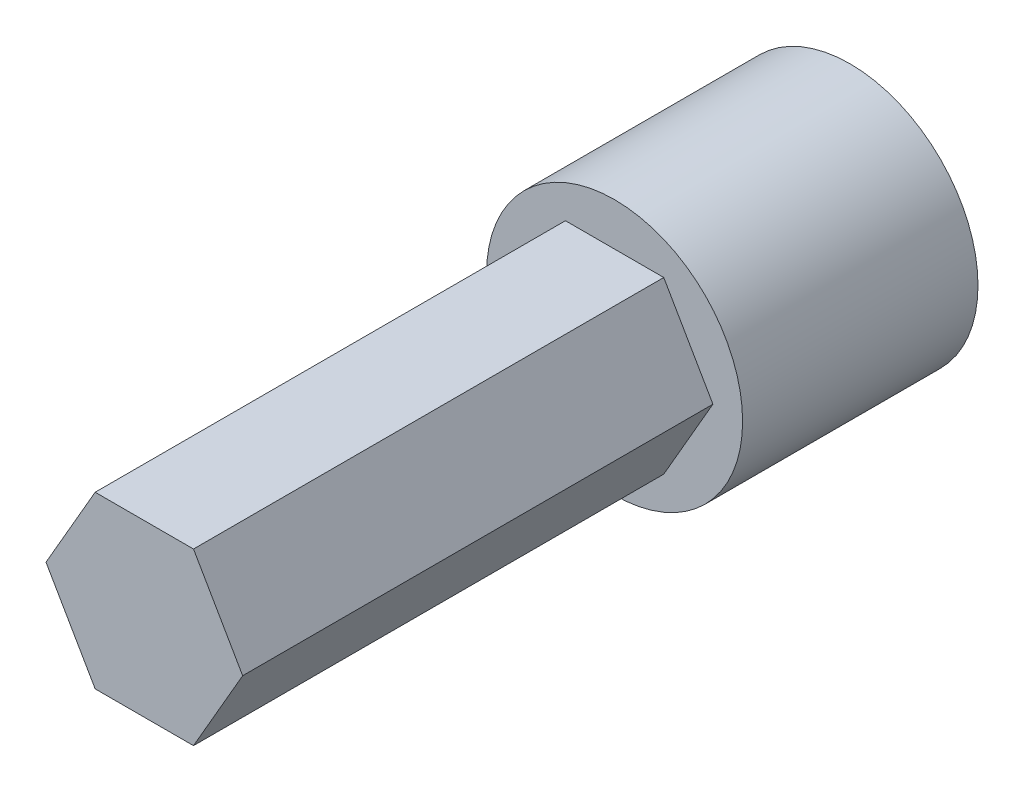
ISO-10303-21;
HEADER;
FILE_DESCRIPTION(('STEP AP214'),'2;1');
FILE_NAME('part.step','',(''),(''),'','','');
FILE_SCHEMA(('AUTOMOTIVE_DESIGN { 1 0 10303 214 1 1 1 1 }'));
ENDSEC;
DATA;
#1=APPLICATION_CONTEXT('core data for automotive mechanical design processes');
#2=APPLICATION_PROTOCOL_DEFINITION('international standard','automotive_design',2000,#1);
#3=PRODUCT_CONTEXT('',#1,'mechanical');
#4=PRODUCT('Part','Part','',(#3));
#5=PRODUCT_RELATED_PRODUCT_CATEGORY('part','',(#4));
#6=PRODUCT_DEFINITION_FORMATION('','',#4);
#7=PRODUCT_DEFINITION_CONTEXT('part definition',#1,'design');
#8=PRODUCT_DEFINITION('design','',#6,#7);
#9=PRODUCT_DEFINITION_SHAPE('','',#8);
#10=(LENGTH_UNIT() NAMED_UNIT(*) SI_UNIT(.MILLI.,.METRE.));
#11=(NAMED_UNIT(*) PLANE_ANGLE_UNIT() SI_UNIT($,.RADIAN.));
#12=(NAMED_UNIT(*) SI_UNIT($,.STERADIAN.) SOLID_ANGLE_UNIT());
#13=UNCERTAINTY_MEASURE_WITH_UNIT(LENGTH_MEASURE(1.E-05),#10,'distance_accuracy_value','');
#14=(GEOMETRIC_REPRESENTATION_CONTEXT(3) GLOBAL_UNCERTAINTY_ASSIGNED_CONTEXT((#13)) GLOBAL_UNIT_ASSIGNED_CONTEXT((#10,
#11,#12)) REPRESENTATION_CONTEXT('',''));
#15=CARTESIAN_POINT('',(0.,0.,0.));
#16=DIRECTION('',(0.,0.,1.));
#17=DIRECTION('',(1.,0.,0.));
#18=AXIS2_PLACEMENT_3D('',#15,#16,#17);
#19=CARTESIAN_POINT('',(4.60471480694878,0.,-22.0218));
#20=DIRECTION('',(0.866025403784439,0.5,0.));
#21=DIRECTION('',(-0.5,0.866025403784439,0.));
#22=AXIS2_PLACEMENT_3D('',#19,#20,#21);
#23=PLANE('',#22);
#24=DIRECTION('',(-0.5,0.866025403784438,0.));
#25=VECTOR('',#24,1.);
#26=CARTESIAN_POINT('',(4.60471480694878,0.,0.));
#27=LINE('',#26,#25);
#28=CARTESIAN_POINT('',(4.60471480694878,0.,0.));
#29=VERTEX_POINT('',#28);
#30=CARTESIAN_POINT('',(2.30235740347439,3.9878,0.));
#31=VERTEX_POINT('',#30);
#32=EDGE_CURVE('E146',#29,#31,#27,.T.);
#33=ORIENTED_EDGE('',*,*,#32,.F.);
#34=DIRECTION('',(0.,0.,1.));
#35=VECTOR('',#34,1.);
#36=CARTESIAN_POINT('',(4.60471480694878,0.,-22.0218));
#37=LINE('',#36,#35);
#38=CARTESIAN_POINT('',(4.60471480694878,0.,-22.0218));
#39=VERTEX_POINT('',#38);
#40=EDGE_CURVE('E11',#39,#29,#37,.T.);
#41=ORIENTED_EDGE('',*,*,#40,.F.);
#42=DIRECTION('',(-0.5,0.866025403784438,0.));
#43=VECTOR('',#42,1.);
#44=CARTESIAN_POINT('',(4.60471480694878,0.,-22.0218));
#45=LINE('',#44,#43);
#46=CARTESIAN_POINT('',(2.30235740347439,3.9878,-22.0218));
#47=VERTEX_POINT('',#46);
#48=EDGE_CURVE('E117',#39,#47,#45,.T.);
#49=ORIENTED_EDGE('',*,*,#48,.T.);
#50=DIRECTION('',(0.,0.,1.));
#51=VECTOR('',#50,1.);
#52=CARTESIAN_POINT('',(2.30235740347439,3.9878,-22.0218));
#53=LINE('',#52,#51);
#54=EDGE_CURVE('E132',#47,#31,#53,.T.);
#55=ORIENTED_EDGE('',*,*,#54,.T.);
#56=EDGE_LOOP('',(#33,#41,#49,#55));
#57=FACE_BOUND('',#56,.T.);
#58=ADVANCED_FACE('F43',(#57),#23,.T.);
#59=CARTESIAN_POINT('',(2.30235740347439,-3.9878,-22.0218));
#60=DIRECTION('',(0.866025403784438,-0.5,0.));
#61=DIRECTION('',(0.5,0.866025403784439,0.));
#62=AXIS2_PLACEMENT_3D('',#59,#60,#61);
#63=PLANE('',#62);
#64=DIRECTION('',(0.5,0.866025403784439,0.));
#65=VECTOR('',#64,1.);
#66=CARTESIAN_POINT('',(2.30235740347439,-3.9878,0.));
#67=LINE('',#66,#65);
#68=CARTESIAN_POINT('',(2.30235740347439,-3.9878,0.));
#69=VERTEX_POINT('',#68);
#70=EDGE_CURVE('E107',#69,#29,#67,.T.);
#71=ORIENTED_EDGE('',*,*,#70,.F.);
#72=DIRECTION('',(0.,0.,1.));
#73=VECTOR('',#72,1.);
#74=CARTESIAN_POINT('',(2.30235740347439,-3.9878,-22.0218));
#75=LINE('',#74,#73);
#76=CARTESIAN_POINT('',(2.30235740347439,-3.9878,-22.0218));
#77=VERTEX_POINT('',#76);
#78=EDGE_CURVE('E58',#77,#69,#75,.T.);
#79=ORIENTED_EDGE('',*,*,#78,.F.);
#80=DIRECTION('',(0.5,0.866025403784439,0.));
#81=VECTOR('',#80,1.);
#82=CARTESIAN_POINT('',(2.30235740347439,-3.9878,-22.0218));
#83=LINE('',#82,#81);
#84=EDGE_CURVE('E134',#77,#39,#83,.T.);
#85=ORIENTED_EDGE('',*,*,#84,.T.);
#86=ORIENTED_EDGE('',*,*,#40,.T.);
#87=EDGE_LOOP('',(#71,#79,#85,#86));
#88=FACE_BOUND('',#87,.T.);
#89=ADVANCED_FACE('F113',(#88),#63,.T.);
#90=CARTESIAN_POINT('',(-2.30235740347439,-3.9878,-22.0218));
#91=DIRECTION('',(0.,-1.,0.));
#92=DIRECTION('',(0.,0.,-1.));
#93=AXIS2_PLACEMENT_3D('',#90,#91,#92);
#94=PLANE('',#93);
#95=DIRECTION('',(1.,0.,0.));
#96=VECTOR('',#95,1.);
#97=CARTESIAN_POINT('',(-2.30235740347439,-3.9878,0.));
#98=LINE('',#97,#96);
#99=CARTESIAN_POINT('',(-2.30235740347439,-3.9878,0.));
#100=VERTEX_POINT('',#99);
#101=EDGE_CURVE('E92',#100,#69,#98,.T.);
#102=ORIENTED_EDGE('',*,*,#101,.F.);
#103=DIRECTION('',(0.,0.,1.));
#104=VECTOR('',#103,1.);
#105=CARTESIAN_POINT('',(-2.30235740347439,-3.9878,-22.0218));
#106=LINE('',#105,#104);
#107=CARTESIAN_POINT('',(-2.30235740347439,-3.9878,-22.0218));
#108=VERTEX_POINT('',#107);
#109=EDGE_CURVE('E101',#108,#100,#106,.T.);
#110=ORIENTED_EDGE('',*,*,#109,.F.);
#111=DIRECTION('',(1.,0.,0.));
#112=VECTOR('',#111,1.);
#113=CARTESIAN_POINT('',(-2.30235740347439,-3.9878,-22.0218));
#114=LINE('',#113,#112);
#115=EDGE_CURVE('E96',#108,#77,#114,.T.);
#116=ORIENTED_EDGE('',*,*,#115,.T.);
#117=ORIENTED_EDGE('',*,*,#78,.T.);
#118=EDGE_LOOP('',(#102,#110,#116,#117));
#119=FACE_BOUND('',#118,.T.);
#120=ADVANCED_FACE('F90',(#119),#94,.T.);
#121=CARTESIAN_POINT('',(-4.60471480694878,0.,-22.0218));
#122=DIRECTION('',(-0.866025403784439,-0.5,0.));
#123=DIRECTION('',(0.5,-0.866025403784439,0.));
#124=AXIS2_PLACEMENT_3D('',#121,#122,#123);
#125=PLANE('',#124);
#126=DIRECTION('',(0.5,-0.866025403784438,0.));
#127=VECTOR('',#126,1.);
#128=CARTESIAN_POINT('',(-4.60471480694878,0.,0.));
#129=LINE('',#128,#127);
#130=CARTESIAN_POINT('',(-4.60471480694878,0.,0.));
#131=VERTEX_POINT('',#130);
#132=EDGE_CURVE('E110',#131,#100,#129,.T.);
#133=ORIENTED_EDGE('',*,*,#132,.F.);
#134=DIRECTION('',(0.,0.,1.));
#135=VECTOR('',#134,1.);
#136=CARTESIAN_POINT('',(-4.60471480694878,0.,-22.0218));
#137=LINE('',#136,#135);
#138=CARTESIAN_POINT('',(-4.60471480694878,0.,-22.0218));
#139=VERTEX_POINT('',#138);
#140=EDGE_CURVE('E127',#139,#131,#137,.T.);
#141=ORIENTED_EDGE('',*,*,#140,.F.);
#142=DIRECTION('',(0.5,-0.866025403784438,0.));
#143=VECTOR('',#142,1.);
#144=CARTESIAN_POINT('',(-4.60471480694878,0.,-22.0218));
#145=LINE('',#144,#143);
#146=EDGE_CURVE('E142',#139,#108,#145,.T.);
#147=ORIENTED_EDGE('',*,*,#146,.T.);
#148=ORIENTED_EDGE('',*,*,#109,.T.);
#149=EDGE_LOOP('',(#133,#141,#147,#148));
#150=FACE_BOUND('',#149,.T.);
#151=ADVANCED_FACE('F224',(#150),#125,.T.);
#152=CARTESIAN_POINT('',(-2.30235740347439,3.9878,-22.0218));
#153=DIRECTION('',(-0.866025403784439,0.5,0.));
#154=DIRECTION('',(-0.5,-0.866025403784439,0.));
#155=AXIS2_PLACEMENT_3D('',#152,#153,#154);
#156=PLANE('',#155);
#157=DIRECTION('',(-0.5,-0.866025403784439,0.));
#158=VECTOR('',#157,1.);
#159=CARTESIAN_POINT('',(-2.30235740347439,3.9878,0.));
#160=LINE('',#159,#158);
#161=CARTESIAN_POINT('',(-2.30235740347439,3.9878,0.));
#162=VERTEX_POINT('',#161);
#163=EDGE_CURVE('E154',#162,#131,#160,.T.);
#164=ORIENTED_EDGE('',*,*,#163,.F.);
#165=DIRECTION('',(0.,0.,1.));
#166=VECTOR('',#165,1.);
#167=CARTESIAN_POINT('',(-2.30235740347439,3.9878,-22.0218));
#168=LINE('',#167,#166);
#169=CARTESIAN_POINT('',(-2.30235740347439,3.9878,-22.0218));
#170=VERTEX_POINT('',#169);
#171=EDGE_CURVE('E130',#170,#162,#168,.T.);
#172=ORIENTED_EDGE('',*,*,#171,.F.);
#173=DIRECTION('',(-0.5,-0.866025403784439,0.));
#174=VECTOR('',#173,1.);
#175=CARTESIAN_POINT('',(-2.30235740347439,3.9878,-22.0218));
#176=LINE('',#175,#174);
#177=EDGE_CURVE('E66',#170,#139,#176,.T.);
#178=ORIENTED_EDGE('',*,*,#177,.T.);
#179=ORIENTED_EDGE('',*,*,#140,.T.);
#180=EDGE_LOOP('',(#164,#172,#178,#179));
#181=FACE_BOUND('',#180,.T.);
#182=ADVANCED_FACE('F219',(#181),#156,.T.);
#183=CARTESIAN_POINT('',(2.30235740347439,3.9878,-22.0218));
#184=DIRECTION('',(0.,1.,0.));
#185=DIRECTION('',(0.,0.,1.));
#186=AXIS2_PLACEMENT_3D('',#183,#184,#185);
#187=PLANE('',#186);
#188=DIRECTION('',(-1.,0.,0.));
#189=VECTOR('',#188,1.);
#190=CARTESIAN_POINT('',(2.30235740347439,3.9878,0.));
#191=LINE('',#190,#189);
#192=EDGE_CURVE('E149',#31,#162,#191,.T.);
#193=ORIENTED_EDGE('',*,*,#192,.F.);
#194=ORIENTED_EDGE('',*,*,#54,.F.);
#195=DIRECTION('',(-1.,0.,0.));
#196=VECTOR('',#195,1.);
#197=CARTESIAN_POINT('',(2.30235740347439,3.9878,-22.0218));
#198=LINE('',#197,#196);
#199=EDGE_CURVE('E121',#47,#170,#198,.T.);
#200=ORIENTED_EDGE('',*,*,#199,.T.);
#201=ORIENTED_EDGE('',*,*,#171,.T.);
#202=EDGE_LOOP('',(#193,#194,#200,#201));
#203=FACE_BOUND('',#202,.T.);
#204=ADVANCED_FACE('F215',(#203),#187,.T.);
#205=CARTESIAN_POINT('',(0.,0.,0.));
#206=DIRECTION('',(0.,0.,1.));
#207=DIRECTION('',(1.,0.,0.));
#208=AXIS2_PLACEMENT_3D('',#205,#206,#207);
#209=PLANE('',#208);
#210=ORIENTED_EDGE('',*,*,#32,.T.);
#211=ORIENTED_EDGE('',*,*,#192,.T.);
#212=ORIENTED_EDGE('',*,*,#163,.T.);
#213=ORIENTED_EDGE('',*,*,#132,.T.);
#214=ORIENTED_EDGE('',*,*,#101,.T.);
#215=ORIENTED_EDGE('',*,*,#70,.T.);
#216=EDGE_LOOP('',(#210,#211,#212,#213,#214,#215));
#217=FACE_BOUND('',#216,.T.);
#218=ADVANCED_FACE('F106',(#217),#209,.T.);
#219=CARTESIAN_POINT('',(0.,0.,-33.0454));
#220=DIRECTION('',(0.,0.,1.));
#221=DIRECTION('',(1.,0.,0.));
#222=AXIS2_PLACEMENT_3D('',#219,#220,#221);
#223=CYLINDRICAL_SURFACE('',#222,5.9944);
#224=CARTESIAN_POINT('',(-4.43845528412342,-4.02901303681644,-29.2354));
#225=CARTESIAN_POINT('',(-4.43845776241539,-4.02901158603755,-29.3058721122266));
#226=CARTESIAN_POINT('',(-4.44251134922713,-4.02455862027529,-29.3763747486204));
#227=CARTESIAN_POINT('',(-4.45850855616532,-4.00682793970532,-29.5153790087802));
#228=CARTESIAN_POINT('',(-4.47045810912053,-3.99354358917329,-29.5838790874297));
#229=CARTESIAN_POINT('',(-4.50158186470221,-3.95842623952485,-29.7168472743186));
#230=CARTESIAN_POINT('',(-4.52074841941931,-3.93660228892899,-29.7813195668025));
#231=CARTESIAN_POINT('',(-4.56532840051582,-3.88481276611611,-29.9045706468878));
#232=CARTESIAN_POINT('',(-4.59074161600226,-3.8548474687548,-29.9633496266072));
#233=CARTESIAN_POINT('',(-4.64701513164665,-3.78682616667383,-30.0744792522474));
#234=CARTESIAN_POINT('',(-4.67794781986696,-3.74866106517343,-30.1267264828467));
#235=CARTESIAN_POINT('',(-4.74361676899912,-3.66520743507961,-30.2224048709838));
#236=CARTESIAN_POINT('',(-4.77835331408443,-3.61991837416852,-30.2658353691604));
#237=CARTESIAN_POINT('',(-4.85052258904617,-3.52263540719384,-30.3430536247508));
#238=CARTESIAN_POINT('',(-4.88797847292026,-3.47057994835762,-30.3767423605947));
#239=CARTESIAN_POINT('',(-4.96376101863079,-3.36129786327118,-30.4328807850948));
#240=CARTESIAN_POINT('',(-5.00208758843806,-3.30407178165576,-30.4553316558385));
#241=CARTESIAN_POINT('',(-5.07760223704151,-3.18678175155763,-30.4880330389489));
#242=CARTESIAN_POINT('',(-5.11479877001745,-3.12677203807768,-30.4984584339973));
#243=CARTESIAN_POINT('',(-5.18738668026429,-3.00481017115259,-30.5073592763601));
#244=CARTESIAN_POINT('',(-5.22277825138895,-2.94285822746279,-30.5058360096984));
#245=CARTESIAN_POINT('',(-5.29019624436891,-2.81984026026947,-30.4910139185905));
#246=CARTESIAN_POINT('',(-5.3222673831065,-2.75877588975423,-30.4779035475392));
#247=CARTESIAN_POINT('',(-5.3829761365,-2.63836100185378,-30.4405791845301));
#248=CARTESIAN_POINT('',(-5.4116136023003,-2.57901055885489,-30.4163647114098));
#249=CARTESIAN_POINT('',(-5.46520527360223,-2.46342306328636,-30.3573498561157));
#250=CARTESIAN_POINT('',(-5.49013252477241,-2.40721048893399,-30.322477140781));
#251=CARTESIAN_POINT('',(-5.53586767276154,-2.30008651533994,-30.2431894868939));
#252=CARTESIAN_POINT('',(-5.55667504029393,-2.24917579763211,-30.1987733238094));
#253=CARTESIAN_POINT('',(-5.59451778670298,-2.15334906342629,-30.1006306076833));
#254=CARTESIAN_POINT('',(-5.61147153105505,-2.10856959622029,-30.0467391123945));
#255=CARTESIAN_POINT('',(-5.64117647357777,-2.02776190966453,-29.9317169832824));
#256=CARTESIAN_POINT('',(-5.65392757158822,-1.99173389889056,-29.8705861769744));
#257=CARTESIAN_POINT('',(-5.67540475256023,-1.92968861910304,-29.7425743765213));
#258=CARTESIAN_POINT('',(-5.68412013163629,-1.9036980020684,-29.675678642559));
#259=CARTESIAN_POINT('',(-5.69761591761673,-1.86291983847047,-29.5381796912991));
#260=CARTESIAN_POINT('',(-5.70239690634732,-1.84813063544346,-29.4675770238344));
#261=CARTESIAN_POINT('',(-5.70806253108008,-1.83055674773179,-29.3261174414924));
#262=CARTESIAN_POINT('',(-5.70902005458161,-1.82754752107186,-29.2552913074714));
#263=CARTESIAN_POINT('',(-5.70725844034468,-1.83304133646233,-29.1141367029739));
#264=CARTESIAN_POINT('',(-5.70453953842717,-1.84154364011618,-29.0438082008684));
#265=CARTESIAN_POINT('',(-5.69542367977153,-1.86954301658048,-28.9064386909404));
#266=CARTESIAN_POINT('',(-5.68906741925722,-1.88891839147313,-28.8393700730105));
#267=CARTESIAN_POINT('',(-5.67259989192555,-1.9378088467073,-28.7095286304978));
#268=CARTESIAN_POINT('',(-5.66248828418409,-1.9673248476336,-28.6467561965512));
#269=CARTESIAN_POINT('',(-5.63819636939435,-2.03590533964759,-28.5262855696315));
#270=CARTESIAN_POINT('',(-5.62395914428911,-2.07510218834596,-28.4686742385116));
#271=CARTESIAN_POINT('',(-5.5913446788828,-2.16143951385938,-28.3610756355755));
#272=CARTESIAN_POINT('',(-5.57296695766876,-2.20858091326271,-28.3110892505184));
#273=CARTESIAN_POINT('',(-5.53165299351339,-2.31012928649021,-28.219271056945));
#274=CARTESIAN_POINT('',(-5.50864303022974,-2.36464836012424,-28.1775961863675));
#275=CARTESIAN_POINT('',(-5.45836241478591,-2.47850319757864,-28.1047028555241));
#276=CARTESIAN_POINT('',(-5.43109195473128,-2.5378387441666,-28.073483924));
#277=CARTESIAN_POINT('',(-5.37278996410345,-2.65903157838443,-28.0226110764688));
#278=CARTESIAN_POINT('',(-5.34178282161566,-2.72087093353603,-28.0028865996924));
#279=CARTESIAN_POINT('',(-5.27647388841536,-2.84545189949601,-27.9753409232297));
#280=CARTESIAN_POINT('',(-5.24217254623361,-2.9081933864858,-27.9675181054765));
#281=CARTESIAN_POINT('',(-5.17186623739874,-3.03142979494974,-27.9640667818623));
#282=CARTESIAN_POINT('',(-5.13590756060616,-3.09194466527735,-27.9682033595352));
#283=CARTESIAN_POINT('',(-5.06277923249063,-3.21028614107004,-27.9880304921672));
#284=CARTESIAN_POINT('',(-5.02560960038431,-3.2681127891592,-28.0037208638645));
#285=CARTESIAN_POINT('',(-4.95143945274324,-3.37942943664585,-28.0461006112399));
#286=CARTESIAN_POINT('',(-4.91443875691107,-3.43293130455754,-28.0727585710765));
#287=CARTESIAN_POINT('',(-4.84185778783637,-3.53456488655606,-28.1362853784201));
#288=CARTESIAN_POINT('',(-4.80627764344167,-3.58269611421879,-28.1731551497695));
#289=CARTESIAN_POINT('',(-4.73731413927005,-3.6734173429378,-28.2568349483848));
#290=CARTESIAN_POINT('',(-4.70398157469183,-3.71589258252887,-28.3038112728619));
#291=CARTESIAN_POINT('',(-4.64165468929655,-3.7934621343707,-28.4060328507187));
#292=CARTESIAN_POINT('',(-4.6126614082823,-3.82855467835427,-28.4612800796939));
#293=CARTESIAN_POINT('',(-4.56003563927137,-3.89109263777133,-28.5792965699655));
#294=CARTESIAN_POINT('',(-4.5364739099659,-3.91843807555586,-28.6421504343783));
#295=CARTESIAN_POINT('',(-4.49640247787302,-3.96435772443731,-28.7730531185369));
#296=CARTESIAN_POINT('',(-4.47988664475047,-3.98293956186222,-28.8410973613328));
#297=CARTESIAN_POINT('',(-4.45781547833449,-4.00760671933172,-28.9636032968355));
#298=CARTESIAN_POINT('',(-4.45057803047669,-4.01562431880517,-29.0173870094483));
#299=CARTESIAN_POINT('',(-4.44089707357674,-4.0263279266125,-29.1259076996371));
#300=CARTESIAN_POINT('',(-4.43845335854217,-4.02901416404144,-29.1806446361499));
#301=CARTESIAN_POINT('',(-4.43845528412342,-4.02901303681644,-29.2354));
#302=B_SPLINE_CURVE_WITH_KNOTS('',3,(#224,#225,#226,#227,#228,#229,#230,#231,#232,#233,#234,
#235,#236,#237,#238,#239,#240,#241,#242,#243,#244,#245,#246,#247,#248,#249,#250,#251,#252,#253,
#254,#255,#256,#257,#258,#259,#260,#261,#262,#263,#264,#265,#266,#267,#268,#269,#270,#271,#272,
#273,#274,#275,#276,#277,#278,#279,#280,#281,#282,#283,#284,#285,#286,#287,#288,#289,#290,#291,
#292,#293,#294,#295,#296,#297,#298,#299,#300,#301),.UNSPECIFIED.,.T.,.F.,(4,2,2,2,2,2,2,2,2,2,2,
2,2,2,2,2,2,2,2,2,2,2,2,2,2,2,2,2,2,2,2,2,2,2,2,2,2,2,4),(0.,0.211215735439656,0.42259035376515,
0.633741604396407,0.844885727347391,1.05903541647215,1.27320111493335,1.48947281277973,
1.70572175667848,1.91878455464646,2.1318244211696,2.34146187451594,2.55110841272222,
2.76221057713853,2.97333984453977,3.18859390424809,3.40385309366087,3.61967998744662,
3.83547495854306,4.04713596581846,4.258783396936,4.46810787978994,4.67745137053093,
4.88983299699031,5.10223930401376,5.31833964366341,5.53443024217216,5.74917996294176,
5.96390048522001,6.17443211497925,6.38496040543909,6.59488980600305,6.80483820467023,
7.01854906577204,7.23231105572558,7.44871760573919,7.66493548368951,7.8290527647232,
7.99316299328696),.UNSPECIFIED.);
#303=CARTESIAN_POINT('',(-4.43845528412342,-4.02901303681644,-29.2354));
#304=VERTEX_POINT('',#303);
#305=EDGE_CURVE('E172',#304,#304,#302,.T.);
#306=ORIENTED_EDGE('',*,*,#305,.T.);
#307=EDGE_LOOP('',(#306));
#308=FACE_BOUND('',#307,.T.);
#309=CARTESIAN_POINT('',(0.,0.,-33.0454));
#310=DIRECTION('',(0.,0.,-1.));
#311=DIRECTION('',(-1.,0.,0.));
#312=AXIS2_PLACEMENT_3D('',#309,#310,#311);
#313=CIRCLE('',#312,5.9944);
#314=CARTESIAN_POINT('',(-5.9944,0.,-33.0454));
#315=VERTEX_POINT('',#314);
#316=EDGE_CURVE('E150',#315,#315,#313,.T.);
#317=ORIENTED_EDGE('',*,*,#316,.F.);
#318=EDGE_LOOP('',(#317));
#319=FACE_BOUND('',#318,.T.);
#320=CARTESIAN_POINT('',(0.,0.,-22.0218));
#321=DIRECTION('',(0.,0.,-1.));
#322=DIRECTION('',(-1.,0.,0.));
#323=AXIS2_PLACEMENT_3D('',#320,#321,#322);
#324=CIRCLE('',#323,5.9944);
#325=CARTESIAN_POINT('',(-5.9944,0.,-22.0218));
#326=VERTEX_POINT('',#325);
#327=EDGE_CURVE('E160',#326,#326,#324,.T.);
#328=ORIENTED_EDGE('',*,*,#327,.T.);
#329=EDGE_LOOP('',(#328));
#330=FACE_BOUND('',#329,.T.);
#331=ADVANCED_FACE('F189',(#308,#319,#330),#223,.T.);
#332=CARTESIAN_POINT('',(0.,0.,-33.0454));
#333=DIRECTION('',(0.,0.,-1.));
#334=DIRECTION('',(-1.,0.,0.));
#335=AXIS2_PLACEMENT_3D('',#332,#333,#334);
#336=PLANE('',#335);
#337=CARTESIAN_POINT('',(0.,0.,-33.0454));
#338=DIRECTION('',(0.,0.,-1.));
#339=DIRECTION('',(-1.,0.,0.));
#340=AXIS2_PLACEMENT_3D('',#337,#338,#339);
#341=CIRCLE('',#340,3.0226);
#342=CARTESIAN_POINT('',(-3.0226,0.,-33.0454));
#343=VERTEX_POINT('',#342);
#344=EDGE_CURVE('E168',#343,#343,#341,.T.);
#345=ORIENTED_EDGE('',*,*,#344,.F.);
#346=EDGE_LOOP('',(#345));
#347=FACE_BOUND('',#346,.T.);
#348=ORIENTED_EDGE('',*,*,#316,.T.);
#349=EDGE_LOOP('',(#348));
#350=FACE_BOUND('',#349,.T.);
#351=ADVANCED_FACE('F192',(#347,#350),#336,.T.);
#352=CARTESIAN_POINT('',(0.,0.,-22.0218));
#353=DIRECTION('',(0.,0.,-1.));
#354=DIRECTION('',(-1.,0.,0.));
#355=AXIS2_PLACEMENT_3D('',#352,#353,#354);
#356=PLANE('',#355);
#357=ORIENTED_EDGE('',*,*,#48,.F.);
#358=ORIENTED_EDGE('',*,*,#84,.F.);
#359=ORIENTED_EDGE('',*,*,#115,.F.);
#360=ORIENTED_EDGE('',*,*,#146,.F.);
#361=ORIENTED_EDGE('',*,*,#177,.F.);
#362=ORIENTED_EDGE('',*,*,#199,.F.);
#363=EDGE_LOOP('',(#357,#358,#359,#360,#361,#362));
#364=FACE_BOUND('',#363,.T.);
#365=ORIENTED_EDGE('',*,*,#327,.F.);
#366=EDGE_LOOP('',(#365));
#367=FACE_BOUND('',#366,.T.);
#368=ADVANCED_FACE('F198',(#364,#367),#356,.F.);
#369=CARTESIAN_POINT('',(0.,0.,-20.4978));
#370=DIRECTION('',(0.,0.,-1.));
#371=DIRECTION('',(-1.,0.,0.));
#372=AXIS2_PLACEMENT_3D('',#369,#370,#371);
#373=CYLINDRICAL_SURFACE('',#372,3.0226);
#374=CARTESIAN_POINT('',(-1.74037535349678,-2.47127586257402,-29.2354));
#375=CARTESIAN_POINT('',(-1.74038574040388,-2.47127293099558,-29.1677198535723));
#376=CARTESIAN_POINT('',(-1.745298684187,-2.46783164541109,-29.0999315930915));
#377=CARTESIAN_POINT('',(-1.76456533567846,-2.45408846247741,-28.9663149199554));
#378=CARTESIAN_POINT('',(-1.77894447971183,-2.44376807958884,-28.9004922886379));
#379=CARTESIAN_POINT('',(-1.8159189809182,-2.41641707968234,-28.7729826565052));
#380=CARTESIAN_POINT('',(-1.83848044393106,-2.39941412036739,-28.7112798207661));
#381=CARTESIAN_POINT('',(-1.89029426785057,-2.35880846760659,-28.5931302994877));
#382=CARTESIAN_POINT('',(-1.91954512446635,-2.33520725769055,-28.5366824362354));
#383=CARTESIAN_POINT('',(-1.98493542913538,-2.27992870339442,-28.4270383756119));
#384=CARTESIAN_POINT('',(-2.0213739405885,-2.24786549935304,-28.3742148964577));
#385=CARTESIAN_POINT('',(-2.09799438975993,-2.17652684283326,-28.2767537616026));
#386=CARTESIAN_POINT('',(-2.1381777759255,-2.13724859395943,-28.2321192932385));
#387=CARTESIAN_POINT('',(-2.22220738778757,-2.04981369671624,-28.1503908872774));
#388=CARTESIAN_POINT('',(-2.26613701117562,-2.00134115783873,-28.1137178676451));
#389=CARTESIAN_POINT('',(-2.35382316007563,-1.89742929784626,-28.0518108893635));
#390=CARTESIAN_POINT('',(-2.39757975480868,-1.84199313329928,-28.0265717715268));
#391=CARTESIAN_POINT('',(-2.48057157259551,-1.72845462962706,-27.9896047103132));
#392=CARTESIAN_POINT('',(-2.51992353658396,-1.67064770600666,-27.9772336194802));
#393=CARTESIAN_POINT('',(-2.59499297636038,-1.55147459333462,-27.9642740643643));
#394=CARTESIAN_POINT('',(-2.6307119466395,-1.49010988427964,-27.9636807354447));
#395=CARTESIAN_POINT('',(-2.695267896216,-1.36968027239344,-27.9739599081308));
#396=CARTESIAN_POINT('',(-2.72439392801596,-1.31070796168314,-27.9841253258336));
#397=CARTESIAN_POINT('',(-2.77788019935574,-1.19317351872432,-28.0144193038228));
#398=CARTESIAN_POINT('',(-2.80224008708994,-1.13461141706214,-28.0345485991907));
#399=CARTESIAN_POINT('',(-2.84642741531149,-1.01875791634732,-28.0844360885251));
#400=CARTESIAN_POINT('',(-2.866179922758,-0.961499600665749,-28.1143366947793));
#401=CARTESIAN_POINT('',(-2.90095660182288,-0.850841247691567,-28.1827770589749));
#402=CARTESIAN_POINT('',(-2.91597908892952,-0.797442590151058,-28.2213198863404));
#403=CARTESIAN_POINT('',(-2.94276158166415,-0.69239461923849,-28.3091544755221));
#404=CARTESIAN_POINT('',(-2.95421147571532,-0.641143450085701,-28.3590177895639));
#405=CARTESIAN_POINT('',(-2.97316091687768,-0.546585292309441,-28.4664694602733));
#406=CARTESIAN_POINT('',(-2.9806588895038,-0.503281474462009,-28.5240608844503));
#407=CARTESIAN_POINT('',(-2.9928283393131,-0.425101746559035,-28.6477968786474));
#408=CARTESIAN_POINT('',(-2.9973953872699,-0.390561288286234,-28.7141652077058));
#409=CARTESIAN_POINT('',(-3.00424589123179,-0.333831565157288,-28.8520895618436));
#410=CARTESIAN_POINT('',(-3.0065310130255,-0.311633295852227,-28.9236417617514));
#411=CARTESIAN_POINT('',(-3.00944171761176,-0.282097180848341,-29.0648907696331));
#412=CARTESIAN_POINT('',(-3.01016640514934,-0.273879379796487,-29.134400973544));
#413=CARTESIAN_POINT('',(-3.01050774868045,-0.27011121895331,-29.2737554376828));
#414=CARTESIAN_POINT('',(-3.01012479890887,-0.27455635210916,-29.3435995702231));
#415=CARTESIAN_POINT('',(-3.00817689622318,-0.295083270870349,-29.4768104361763));
#416=CARTESIAN_POINT('',(-3.00669111418424,-0.31038272670967,-29.540301558485));
#417=CARTESIAN_POINT('',(-3.00223327633599,-0.350881753063433,-29.6639803158033));
#418=CARTESIAN_POINT('',(-2.99926086916554,-0.376083663702993,-29.7241671661203));
#419=CARTESIAN_POINT('',(-2.99108209202925,-0.436465114997177,-29.8424022202715));
#420=CARTESIAN_POINT('',(-2.98578575892884,-0.472024720356395,-29.900249393447));
#421=CARTESIAN_POINT('',(-2.97219559729114,-0.551157178102823,-30.0097917126596));
#422=CARTESIAN_POINT('',(-2.96390045472655,-0.594733539178794,-30.0614841485751));
#423=CARTESIAN_POINT('',(-2.94270002362393,-0.692328598908397,-30.1617188539098));
#424=CARTESIAN_POINT('',(-2.92946907330039,-0.746913977595261,-30.2096429517609));
#425=CARTESIAN_POINT('',(-2.89773269217689,-0.861862770101649,-30.2958824464475));
#426=CARTESIAN_POINT('',(-2.8792268352237,-0.922226650497455,-30.3341970664748));
#427=CARTESIAN_POINT('',(-2.83627889135153,-1.04689430503433,-30.4001118568467));
#428=CARTESIAN_POINT('',(-2.81181788028674,-1.11121014058753,-30.4276771268366));
#429=CARTESIAN_POINT('',(-2.75686821798978,-1.24127326962292,-30.4707847572291));
#430=CARTESIAN_POINT('',(-2.72638323553752,-1.3070196702664,-30.4863344073403));
#431=CARTESIAN_POINT('',(-2.66226261722544,-1.43286447358454,-30.5040401304298));
#432=CARTESIAN_POINT('',(-2.62900340869437,-1.49303292109783,-30.5070673490937));
#433=CARTESIAN_POINT('',(-2.55866781179238,-1.61059565675477,-30.5019932189274));
#434=CARTESIAN_POINT('',(-2.52159211385119,-1.667990443922,-30.4938938797082));
#435=CARTESIAN_POINT('',(-2.4463758262619,-1.7763880323212,-30.4674220336295));
#436=CARTESIAN_POINT('',(-2.40832360165081,-1.82754773656352,-30.4494355826215));
#437=CARTESIAN_POINT('',(-2.33133065704373,-1.92480093455984,-30.404125040872));
#438=CARTESIAN_POINT('',(-2.29238977104755,-1.97089347226643,-30.3767991920025));
#439=CARTESIAN_POINT('',(-2.2133497627341,-2.05933746286991,-30.3122025137719));
#440=CARTESIAN_POINT('',(-2.17327818661226,-2.10142451097968,-30.2745369240842));
#441=CARTESIAN_POINT('',(-2.09548316898046,-2.17900999187792,-30.1909005099903));
#442=CARTESIAN_POINT('',(-2.05776062405933,-2.21450591905878,-30.1449265402138));
#443=CARTESIAN_POINT('',(-1.98390440847664,-2.28098049128329,-30.0422188316402));
#444=CARTESIAN_POINT('',(-1.94806262503612,-2.31147476712774,-29.9849598344183));
#445=CARTESIAN_POINT('',(-1.88315692153815,-2.36465609619933,-29.8633307596376));
#446=CARTESIAN_POINT('',(-1.8540968329254,-2.38733873952511,-29.7989566924041));
#447=CARTESIAN_POINT('',(-1.80499146277741,-2.42467911770817,-29.6649992683875));
#448=CARTESIAN_POINT('',(-1.78490707578572,-2.43937172562529,-29.5954400806784));
#449=CARTESIAN_POINT('',(-1.75539642753493,-2.46069909454187,-29.4530485517117));
#450=CARTESIAN_POINT('',(-1.74593442184689,-2.4673608849508,-29.3802280503916));
#451=CARTESIAN_POINT('',(-1.74098046372027,-2.47084839798578,-29.2832292546905));
#452=CARTESIAN_POINT('',(-1.74037168227015,-2.47127689873317,-29.2593213804276));
#453=CARTESIAN_POINT('',(-1.74037535349678,-2.47127586257402,-29.2354));
#454=B_SPLINE_CURVE_WITH_KNOTS('',3,(#374,#375,#376,#377,#378,#379,#380,#381,#382,#383,#384,
#385,#386,#387,#388,#389,#390,#391,#392,#393,#394,#395,#396,#397,#398,#399,#400,#401,#402,#403,
#404,#405,#406,#407,#408,#409,#410,#411,#412,#413,#414,#415,#416,#417,#418,#419,#420,#421,#422,
#423,#424,#425,#426,#427,#428,#429,#430,#431,#432,#433,#434,#435,#436,#437,#438,#439,#440,#441,
#442,#443,#444,#445,#446,#447,#448,#449,#450,#451,#452,#453),.UNSPECIFIED.,.T.,.F.,(4,2,2,2,2,2,
2,2,2,2,2,2,2,2,2,2,2,2,2,2,2,2,2,2,2,2,2,2,2,2,2,2,2,2,2,2,2,2,2,4),(0.,0.202970983842252,
0.406489602938239,0.609174626642193,0.811814115884197,1.02608699473283,1.24044309701838,
1.46428170324142,1.68801920851183,1.89994089661527,2.11177505166238,2.31050369376474,
2.50924699918739,2.71102671586446,2.91287821169446,3.12916378467375,3.34553546297925,
3.56924177042671,3.79278465434306,4.0016511738834,4.21044336193053,4.40554157850814,
4.60068592799912,4.80416220044873,5.00772774102383,5.22819960568129,5.44868928704157,
5.6698889967806,5.89095440215437,6.09635207491427,6.30171265487899,6.49957199977891,
6.69746861194304,6.90433862733506,7.11128712386013,7.33259584433351,7.55402929621751,
7.77448836738166,7.99420334668524,8.06594293911432),.UNSPECIFIED.);
#455=CARTESIAN_POINT('',(-1.74037535349678,-2.47127586257402,-29.2354));
#456=VERTEX_POINT('',#455);
#457=EDGE_CURVE('E46',#456,#456,#454,.T.);
#458=ORIENTED_EDGE('',*,*,#457,.T.);
#459=EDGE_LOOP('',(#458));
#460=FACE_BOUND('',#459,.T.);
#461=CARTESIAN_POINT('',(0.,0.,-20.4978));
#462=DIRECTION('',(0.,0.,-1.));
#463=DIRECTION('',(-1.,0.,0.));
#464=AXIS2_PLACEMENT_3D('',#461,#462,#463);
#465=CIRCLE('',#464,3.0226);
#466=CARTESIAN_POINT('',(-3.0226,0.,-20.4978));
#467=VERTEX_POINT('',#466);
#468=EDGE_CURVE('E164',#467,#467,#465,.T.);
#469=ORIENTED_EDGE('',*,*,#468,.F.);
#470=EDGE_LOOP('',(#469));
#471=FACE_BOUND('',#470,.T.);
#472=ORIENTED_EDGE('',*,*,#344,.T.);
#473=EDGE_LOOP('',(#472));
#474=FACE_BOUND('',#473,.T.);
#475=ADVANCED_FACE('F180',(#460,#471,#474),#373,.F.);
#476=CARTESIAN_POINT('',(0.,0.,-20.4978));
#477=DIRECTION('',(0.,0.,-1.));
#478=DIRECTION('',(-1.,0.,0.));
#479=AXIS2_PLACEMENT_3D('',#476,#477,#478);
#480=PLANE('',#479);
#481=ORIENTED_EDGE('',*,*,#468,.T.);
#482=EDGE_LOOP('',(#481));
#483=FACE_BOUND('',#482,.T.);
#484=ADVANCED_FACE('F186',(#483),#480,.T.);
#485=CARTESIAN_POINT('',(0.307958633585744,0.177799999999999,-29.2354));
#486=DIRECTION('',(-0.866025403784437,-0.500000000000002,0.));
#487=DIRECTION('',(0.500000000000002,-0.866025403784438,0.));
#488=AXIS2_PLACEMENT_3D('',#485,#486,#487);
#489=CYLINDRICAL_SURFACE('',#488,1.27);
#490=ORIENTED_EDGE('',*,*,#457,.F.);
#491=EDGE_LOOP('',(#490));
#492=FACE_BOUND('',#491,.T.);
#493=ORIENTED_EDGE('',*,*,#305,.F.);
#494=EDGE_LOOP('',(#493));
#495=FACE_BOUND('',#494,.T.);
#496=ADVANCED_FACE('F183',(#492,#495),#489,.F.);
#497=CLOSED_SHELL('',(#58,#89,#120,#151,#182,#204,#218,#331,#351,#368,#475,#484,#496));
#498=MANIFOLD_SOLID_BREP('B2',#497);
#499=ADVANCED_BREP_SHAPE_REPRESENTATION('',(#18,#498),#14);
#500=SHAPE_DEFINITION_REPRESENTATION(#9,#499);
ENDSEC;
END-ISO-10303-21;
